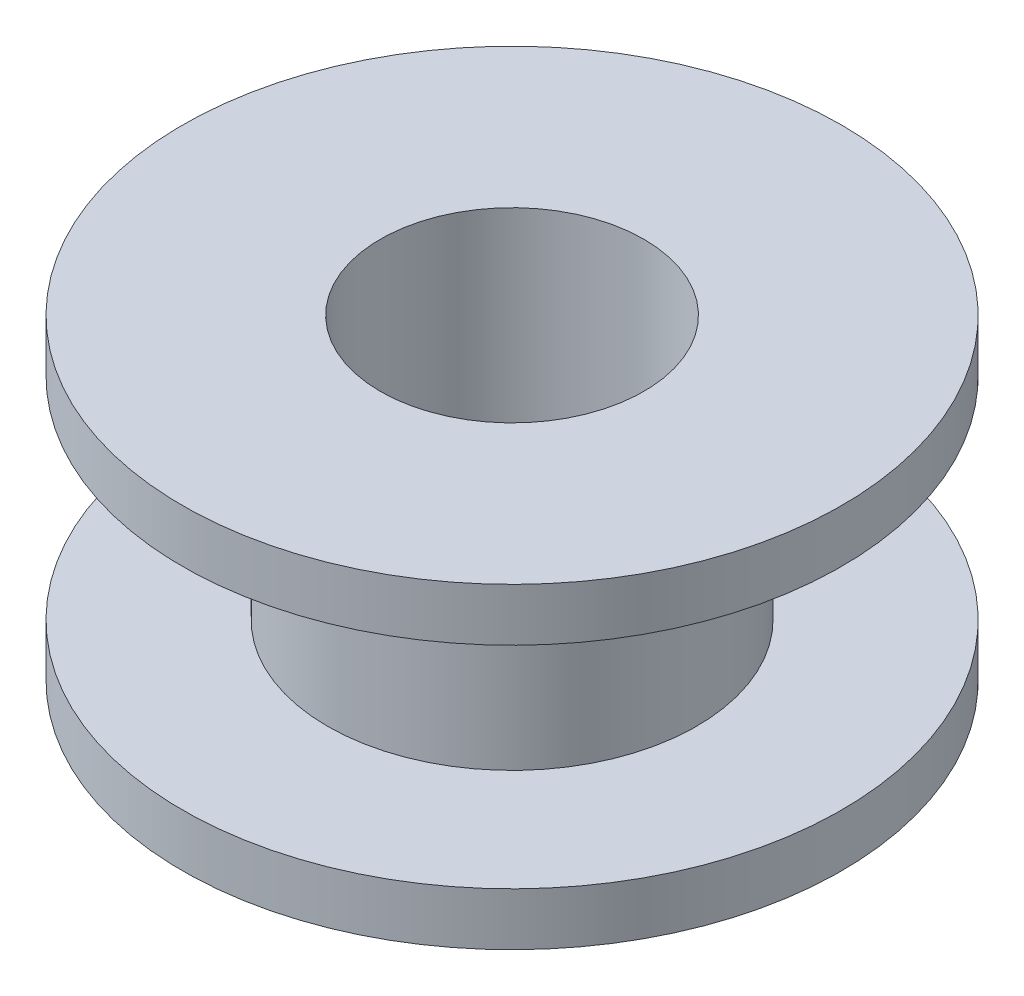
ISO-10303-21;
HEADER;
FILE_DESCRIPTION(('STEP AP214'),'2;1');
FILE_NAME('part.step','',(''),(''),'','','');
FILE_SCHEMA(('AUTOMOTIVE_DESIGN { 1 0 10303 214 1 1 1 1 }'));
ENDSEC;
DATA;
#1=APPLICATION_CONTEXT('core data for automotive mechanical design processes');
#2=APPLICATION_PROTOCOL_DEFINITION('international standard','automotive_design',2000,#1);
#3=PRODUCT_CONTEXT('',#1,'mechanical');
#4=PRODUCT('Part','Part','',(#3));
#5=PRODUCT_RELATED_PRODUCT_CATEGORY('part','',(#4));
#6=PRODUCT_DEFINITION_FORMATION('','',#4);
#7=PRODUCT_DEFINITION_CONTEXT('part definition',#1,'design');
#8=PRODUCT_DEFINITION('design','',#6,#7);
#9=PRODUCT_DEFINITION_SHAPE('','',#8);
#10=(LENGTH_UNIT() NAMED_UNIT(*) SI_UNIT(.MILLI.,.METRE.));
#11=(NAMED_UNIT(*) PLANE_ANGLE_UNIT() SI_UNIT($,.RADIAN.));
#12=(NAMED_UNIT(*) SI_UNIT($,.STERADIAN.) SOLID_ANGLE_UNIT());
#13=UNCERTAINTY_MEASURE_WITH_UNIT(LENGTH_MEASURE(1.E-05),#10,'distance_accuracy_value','');
#14=(GEOMETRIC_REPRESENTATION_CONTEXT(3) GLOBAL_UNCERTAINTY_ASSIGNED_CONTEXT((#13)) GLOBAL_UNIT_ASSIGNED_CONTEXT((#10,
#11,#12)) REPRESENTATION_CONTEXT('',''));
#15=CARTESIAN_POINT('',(0.,0.,0.));
#16=DIRECTION('',(0.,0.,1.));
#17=DIRECTION('',(1.,0.,0.));
#18=AXIS2_PLACEMENT_3D('',#15,#16,#17);
#19=CARTESIAN_POINT('',(0.,2.,0.));
#20=DIRECTION('',(0.,1.,0.));
#21=DIRECTION('',(0.,0.,1.));
#22=AXIS2_PLACEMENT_3D('',#19,#20,#21);
#23=PLANE('',#22);
#24=CARTESIAN_POINT('',(0.,2.,0.));
#25=DIRECTION('',(0.,-1.,0.));
#26=DIRECTION('',(0.,0.,-1.));
#27=AXIS2_PLACEMENT_3D('',#24,#25,#26);
#28=CIRCLE('',#27,12.5);
#29=CARTESIAN_POINT('',(0.,2.,-12.5));
#30=VERTEX_POINT('',#29);
#31=EDGE_CURVE('E40',#30,#30,#28,.T.);
#32=ORIENTED_EDGE('',*,*,#31,.F.);
#33=EDGE_LOOP('',(#32));
#34=FACE_BOUND('',#33,.T.);
#35=CARTESIAN_POINT('',(0.,2.,0.));
#36=DIRECTION('',(0.,1.,0.));
#37=DIRECTION('',(0.,0.,1.));
#38=AXIS2_PLACEMENT_3D('',#35,#36,#37);
#39=CIRCLE('',#38,7.);
#40=CARTESIAN_POINT('',(0.,2.,7.));
#41=VERTEX_POINT('',#40);
#42=EDGE_CURVE('E18',#41,#41,#39,.T.);
#43=ORIENTED_EDGE('',*,*,#42,.F.);
#44=EDGE_LOOP('',(#43));
#45=FACE_BOUND('',#44,.T.);
#46=ADVANCED_FACE('F15',(#34,#45),#23,.T.);
#47=CARTESIAN_POINT('',(0.,2.,0.));
#48=DIRECTION('',(0.,1.,0.));
#49=DIRECTION('',(0.,0.,1.));
#50=AXIS2_PLACEMENT_3D('',#47,#48,#49);
#51=CYLINDRICAL_SURFACE('',#50,7.);
#52=CARTESIAN_POINT('',(0.,10.,0.));
#53=DIRECTION('',(0.,1.,0.));
#54=DIRECTION('',(0.,0.,1.));
#55=AXIS2_PLACEMENT_3D('',#52,#53,#54);
#56=CIRCLE('',#55,7.);
#57=CARTESIAN_POINT('',(0.,10.,7.));
#58=VERTEX_POINT('',#57);
#59=EDGE_CURVE('E38',#58,#58,#56,.F.);
#60=ORIENTED_EDGE('',*,*,#59,.T.);
#61=EDGE_LOOP('',(#60));
#62=FACE_BOUND('',#61,.T.);
#63=ORIENTED_EDGE('',*,*,#42,.T.);
#64=EDGE_LOOP('',(#63));
#65=FACE_BOUND('',#64,.T.);
#66=ADVANCED_FACE('F47',(#62,#65),#51,.T.);
#67=CARTESIAN_POINT('',(0.,12.,0.));
#68=DIRECTION('',(0.,-1.,0.));
#69=DIRECTION('',(0.,0.,-1.));
#70=AXIS2_PLACEMENT_3D('',#67,#68,#69);
#71=CYLINDRICAL_SURFACE('',#70,12.5);
#72=ORIENTED_EDGE('',*,*,#31,.T.);
#73=EDGE_LOOP('',(#72));
#74=FACE_BOUND('',#73,.T.);
#75=CARTESIAN_POINT('',(0.,0.,0.));
#76=DIRECTION('',(0.,-1.,0.));
#77=DIRECTION('',(0.,0.,-1.));
#78=AXIS2_PLACEMENT_3D('',#75,#76,#77);
#79=CIRCLE('',#78,12.5);
#80=CARTESIAN_POINT('',(0.,0.,-12.5));
#81=VERTEX_POINT('',#80);
#82=EDGE_CURVE('E35',#81,#81,#79,.F.);
#83=ORIENTED_EDGE('',*,*,#82,.T.);
#84=EDGE_LOOP('',(#83));
#85=FACE_BOUND('',#84,.T.);
#86=ADVANCED_FACE('F55',(#74,#85),#71,.T.);
#87=CARTESIAN_POINT('',(0.,10.,0.));
#88=DIRECTION('',(0.,1.,0.));
#89=DIRECTION('',(0.,0.,1.));
#90=AXIS2_PLACEMENT_3D('',#87,#88,#89);
#91=PLANE('',#90);
#92=CARTESIAN_POINT('',(0.,10.,0.));
#93=DIRECTION('',(0.,-1.,0.));
#94=DIRECTION('',(0.,0.,-1.));
#95=AXIS2_PLACEMENT_3D('',#92,#93,#94);
#96=CIRCLE('',#95,12.5);
#97=CARTESIAN_POINT('',(0.,10.,-12.5));
#98=VERTEX_POINT('',#97);
#99=EDGE_CURVE('E32',#98,#98,#96,.F.);
#100=ORIENTED_EDGE('',*,*,#99,.F.);
#101=EDGE_LOOP('',(#100));
#102=FACE_BOUND('',#101,.T.);
#103=ORIENTED_EDGE('',*,*,#59,.F.);
#104=EDGE_LOOP('',(#103));
#105=FACE_BOUND('',#104,.T.);
#106=ADVANCED_FACE('F75',(#102,#105),#91,.F.);
#107=CARTESIAN_POINT('',(0.,0.,0.));
#108=DIRECTION('',(0.,1.,0.));
#109=DIRECTION('',(0.,0.,1.));
#110=AXIS2_PLACEMENT_3D('',#107,#108,#109);
#111=PLANE('',#110);
#112=CARTESIAN_POINT('',(0.,0.,0.));
#113=DIRECTION('',(0.,-1.,0.));
#114=DIRECTION('',(0.,0.,-1.));
#115=AXIS2_PLACEMENT_3D('',#112,#113,#114);
#116=CIRCLE('',#115,5.);
#117=CARTESIAN_POINT('',(0.,0.,-5.));
#118=VERTEX_POINT('',#117);
#119=EDGE_CURVE('E27',#118,#118,#116,.F.);
#120=ORIENTED_EDGE('',*,*,#119,.T.);
#121=EDGE_LOOP('',(#120));
#122=FACE_BOUND('',#121,.T.);
#123=ORIENTED_EDGE('',*,*,#82,.F.);
#124=EDGE_LOOP('',(#123));
#125=FACE_BOUND('',#124,.T.);
#126=ADVANCED_FACE('F71',(#122,#125),#111,.F.);
#127=CARTESIAN_POINT('',(0.,12.,0.));
#128=DIRECTION('',(0.,-1.,0.));
#129=DIRECTION('',(0.,0.,-1.));
#130=AXIS2_PLACEMENT_3D('',#127,#128,#129);
#131=CYLINDRICAL_SURFACE('',#130,12.5);
#132=ORIENTED_EDGE('',*,*,#99,.T.);
#133=EDGE_LOOP('',(#132));
#134=FACE_BOUND('',#133,.T.);
#135=CARTESIAN_POINT('',(0.,12.,0.));
#136=DIRECTION('',(0.,-1.,0.));
#137=DIRECTION('',(0.,0.,-1.));
#138=AXIS2_PLACEMENT_3D('',#135,#136,#137);
#139=CIRCLE('',#138,12.5);
#140=CARTESIAN_POINT('',(0.,12.,-12.5));
#141=VERTEX_POINT('',#140);
#142=EDGE_CURVE('E22',#141,#141,#139,.F.);
#143=ORIENTED_EDGE('',*,*,#142,.F.);
#144=EDGE_LOOP('',(#143));
#145=FACE_BOUND('',#144,.T.);
#146=ADVANCED_FACE('F64',(#134,#145),#131,.T.);
#147=CARTESIAN_POINT('',(0.,12.,0.));
#148=DIRECTION('',(0.,-1.,0.));
#149=DIRECTION('',(0.,0.,-1.));
#150=AXIS2_PLACEMENT_3D('',#147,#148,#149);
#151=CYLINDRICAL_SURFACE('',#150,5.);
#152=CARTESIAN_POINT('',(0.,12.,0.));
#153=DIRECTION('',(0.,-1.,0.));
#154=DIRECTION('',(0.,0.,-1.));
#155=AXIS2_PLACEMENT_3D('',#152,#153,#154);
#156=CIRCLE('',#155,5.);
#157=CARTESIAN_POINT('',(0.,12.,-5.));
#158=VERTEX_POINT('',#157);
#159=EDGE_CURVE('E10',#158,#158,#156,.T.);
#160=ORIENTED_EDGE('',*,*,#159,.F.);
#161=EDGE_LOOP('',(#160));
#162=FACE_BOUND('',#161,.T.);
#163=ORIENTED_EDGE('',*,*,#119,.F.);
#164=EDGE_LOOP('',(#163));
#165=FACE_BOUND('',#164,.T.);
#166=ADVANCED_FACE('F59',(#162,#165),#151,.F.);
#167=CARTESIAN_POINT('',(0.,12.,0.));
#168=DIRECTION('',(0.,1.,0.));
#169=DIRECTION('',(0.,0.,1.));
#170=AXIS2_PLACEMENT_3D('',#167,#168,#169);
#171=PLANE('',#170);
#172=ORIENTED_EDGE('',*,*,#159,.T.);
#173=EDGE_LOOP('',(#172));
#174=FACE_BOUND('',#173,.T.);
#175=ORIENTED_EDGE('',*,*,#142,.T.);
#176=EDGE_LOOP('',(#175));
#177=FACE_BOUND('',#176,.T.);
#178=ADVANCED_FACE('F57',(#174,#177),#171,.T.);
#179=CLOSED_SHELL('',(#46,#66,#86,#106,#126,#146,#166,#178));
#180=MANIFOLD_SOLID_BREP('B1',#179);
#181=ADVANCED_BREP_SHAPE_REPRESENTATION('',(#18,#180),#14);
#182=SHAPE_DEFINITION_REPRESENTATION(#9,#181);
ENDSEC;
END-ISO-10303-21;
